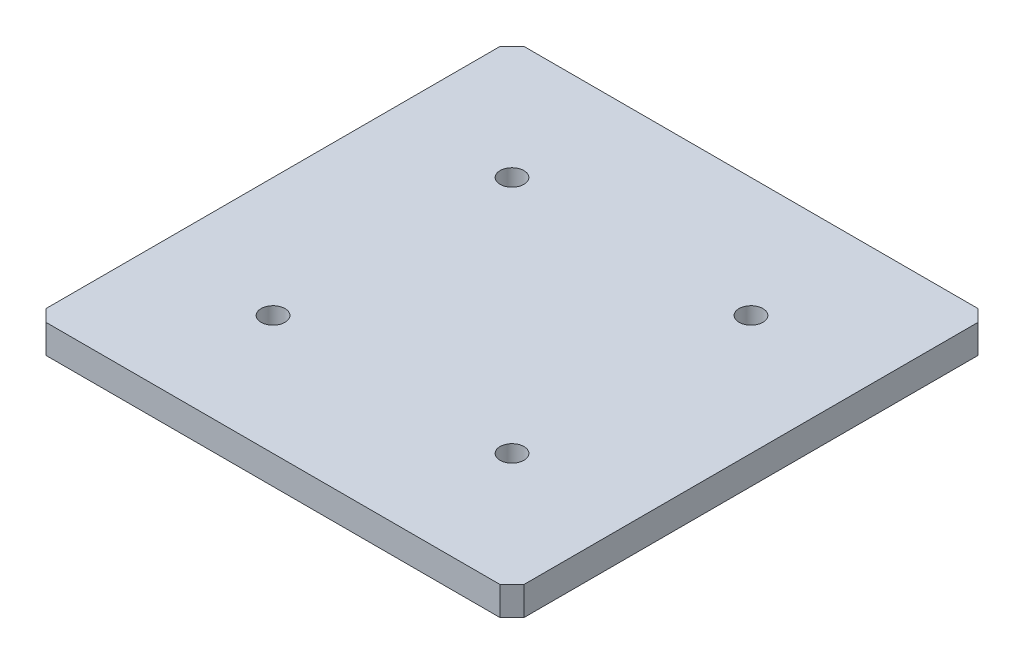
ISO-10303-21;
HEADER;
FILE_DESCRIPTION(('STEP AP214'),'2;1');
FILE_NAME('part.step','',(''),(''),'','','');
FILE_SCHEMA(('AUTOMOTIVE_DESIGN { 1 0 10303 214 1 1 1 1 }'));
ENDSEC;
DATA;
#1=APPLICATION_CONTEXT('core data for automotive mechanical design processes');
#2=APPLICATION_PROTOCOL_DEFINITION('international standard','automotive_design',2000,#1);
#3=PRODUCT_CONTEXT('',#1,'mechanical');
#4=PRODUCT('Part','Part','',(#3));
#5=PRODUCT_RELATED_PRODUCT_CATEGORY('part','',(#4));
#6=PRODUCT_DEFINITION_FORMATION('','',#4);
#7=PRODUCT_DEFINITION_CONTEXT('part definition',#1,'design');
#8=PRODUCT_DEFINITION('design','',#6,#7);
#9=PRODUCT_DEFINITION_SHAPE('','',#8);
#10=(LENGTH_UNIT() NAMED_UNIT(*) SI_UNIT(.MILLI.,.METRE.));
#11=(NAMED_UNIT(*) PLANE_ANGLE_UNIT() SI_UNIT($,.RADIAN.));
#12=(NAMED_UNIT(*) SI_UNIT($,.STERADIAN.) SOLID_ANGLE_UNIT());
#13=UNCERTAINTY_MEASURE_WITH_UNIT(LENGTH_MEASURE(1.E-05),#10,'distance_accuracy_value','');
#14=(GEOMETRIC_REPRESENTATION_CONTEXT(3) GLOBAL_UNCERTAINTY_ASSIGNED_CONTEXT((#13)) GLOBAL_UNIT_ASSIGNED_CONTEXT((#10,
#11,#12)) REPRESENTATION_CONTEXT('',''));
#15=CARTESIAN_POINT('',(0.,0.,0.));
#16=DIRECTION('',(0.,0.,1.));
#17=DIRECTION('',(1.,0.,0.));
#18=AXIS2_PLACEMENT_3D('',#15,#16,#17);
#19=CARTESIAN_POINT('',(-100.,12.,100.));
#20=DIRECTION('',(1.,0.,0.));
#21=DIRECTION('',(0.,0.,-1.));
#22=AXIS2_PLACEMENT_3D('',#19,#20,#21);
#23=PLANE('',#22);
#24=DIRECTION('',(0.,0.,1.));
#25=VECTOR('',#24,1.);
#26=CARTESIAN_POINT('',(-100.,12.,100.));
#27=LINE('',#26,#25);
#28=CARTESIAN_POINT('',(-100.,12.,-94.9999999999999));
#29=VERTEX_POINT('',#28);
#30=CARTESIAN_POINT('',(-100.,12.,95.));
#31=VERTEX_POINT('',#30);
#32=EDGE_CURVE('E120',#29,#31,#27,.T.);
#33=ORIENTED_EDGE('',*,*,#32,.F.);
#34=DIRECTION('',(0.,-1.,0.));
#35=VECTOR('',#34,1.);
#36=CARTESIAN_POINT('',(-100.,12.,-95.));
#37=LINE('',#36,#35);
#38=CARTESIAN_POINT('',(-100.,0.,-95.));
#39=VERTEX_POINT('',#38);
#40=EDGE_CURVE('E105',#29,#39,#37,.T.);
#41=ORIENTED_EDGE('',*,*,#40,.T.);
#42=DIRECTION('',(0.,0.,1.));
#43=VECTOR('',#42,1.);
#44=CARTESIAN_POINT('',(-100.,0.,100.));
#45=LINE('',#44,#43);
#46=CARTESIAN_POINT('',(-100.,0.,95.));
#47=VERTEX_POINT('',#46);
#48=EDGE_CURVE('E117',#39,#47,#45,.T.);
#49=ORIENTED_EDGE('',*,*,#48,.T.);
#50=DIRECTION('',(0.,1.,0.));
#51=VECTOR('',#50,1.);
#52=CARTESIAN_POINT('',(-100.,12.,95.));
#53=LINE('',#52,#51);
#54=EDGE_CURVE('E122',#47,#31,#53,.T.);
#55=ORIENTED_EDGE('',*,*,#54,.T.);
#56=EDGE_LOOP('',(#33,#41,#49,#55));
#57=FACE_BOUND('',#56,.T.);
#58=ADVANCED_FACE('F35',(#57),#23,.F.);
#59=CARTESIAN_POINT('',(-100.,12.,100.));
#60=DIRECTION('',(0.,0.,-1.));
#61=DIRECTION('',(-1.,0.,0.));
#62=AXIS2_PLACEMENT_3D('',#59,#60,#61);
#63=PLANE('',#62);
#64=DIRECTION('',(1.,0.,0.));
#65=VECTOR('',#64,1.);
#66=CARTESIAN_POINT('',(-100.,0.,100.));
#67=LINE('',#66,#65);
#68=CARTESIAN_POINT('',(-95.,0.,100.));
#69=VERTEX_POINT('',#68);
#70=CARTESIAN_POINT('',(95.,0.,100.));
#71=VERTEX_POINT('',#70);
#72=EDGE_CURVE('E126',#69,#71,#67,.T.);
#73=ORIENTED_EDGE('',*,*,#72,.T.);
#74=DIRECTION('',(0.,1.,0.));
#75=VECTOR('',#74,1.);
#76=CARTESIAN_POINT('',(95.,12.,100.));
#77=LINE('',#76,#75);
#78=CARTESIAN_POINT('',(94.9999999999999,12.,100.));
#79=VERTEX_POINT('',#78);
#80=EDGE_CURVE('E11',#71,#79,#77,.T.);
#81=ORIENTED_EDGE('',*,*,#80,.T.);
#82=DIRECTION('',(1.,0.,0.));
#83=VECTOR('',#82,1.);
#84=CARTESIAN_POINT('',(-100.,12.,100.));
#85=LINE('',#84,#83);
#86=CARTESIAN_POINT('',(-95.,12.,100.));
#87=VERTEX_POINT('',#86);
#88=EDGE_CURVE('E166',#87,#79,#85,.T.);
#89=ORIENTED_EDGE('',*,*,#88,.F.);
#90=DIRECTION('',(0.,-1.,0.));
#91=VECTOR('',#90,1.);
#92=CARTESIAN_POINT('',(-95.,12.,100.));
#93=LINE('',#92,#91);
#94=EDGE_CURVE('E43',#87,#69,#93,.T.);
#95=ORIENTED_EDGE('',*,*,#94,.T.);
#96=EDGE_LOOP('',(#73,#81,#89,#95));
#97=FACE_BOUND('',#96,.T.);
#98=ADVANCED_FACE('F164',(#97),#63,.F.);
#99=CARTESIAN_POINT('',(100.,12.,100.));
#100=DIRECTION('',(-1.,0.,0.));
#101=DIRECTION('',(0.,0.,1.));
#102=AXIS2_PLACEMENT_3D('',#99,#100,#101);
#103=PLANE('',#102);
#104=DIRECTION('',(0.,0.,-1.));
#105=VECTOR('',#104,1.);
#106=CARTESIAN_POINT('',(100.,0.,100.));
#107=LINE('',#106,#105);
#108=CARTESIAN_POINT('',(100.,0.,95.));
#109=VERTEX_POINT('',#108);
#110=CARTESIAN_POINT('',(100.,0.,-95.));
#111=VERTEX_POINT('',#110);
#112=EDGE_CURVE('E130',#109,#111,#107,.T.);
#113=ORIENTED_EDGE('',*,*,#112,.T.);
#114=DIRECTION('',(0.,1.,0.));
#115=VECTOR('',#114,1.);
#116=CARTESIAN_POINT('',(100.,12.,-95.));
#117=LINE('',#116,#115);
#118=CARTESIAN_POINT('',(100.,12.,-94.9999999999999));
#119=VERTEX_POINT('',#118);
#120=EDGE_CURVE('E50',#111,#119,#117,.T.);
#121=ORIENTED_EDGE('',*,*,#120,.T.);
#122=DIRECTION('',(0.,0.,-1.));
#123=VECTOR('',#122,1.);
#124=CARTESIAN_POINT('',(100.,12.,100.));
#125=LINE('',#124,#123);
#126=CARTESIAN_POINT('',(100.,12.,95.));
#127=VERTEX_POINT('',#126);
#128=EDGE_CURVE('E174',#127,#119,#125,.T.);
#129=ORIENTED_EDGE('',*,*,#128,.F.);
#130=DIRECTION('',(0.,-1.,0.));
#131=VECTOR('',#130,1.);
#132=CARTESIAN_POINT('',(100.,12.,95.));
#133=LINE('',#132,#131);
#134=EDGE_CURVE('E157',#127,#109,#133,.T.);
#135=ORIENTED_EDGE('',*,*,#134,.T.);
#136=EDGE_LOOP('',(#113,#121,#129,#135));
#137=FACE_BOUND('',#136,.T.);
#138=ADVANCED_FACE('F173',(#137),#103,.F.);
#139=CARTESIAN_POINT('',(-100.,12.,-100.));
#140=DIRECTION('',(0.,0.,1.));
#141=DIRECTION('',(1.,0.,0.));
#142=AXIS2_PLACEMENT_3D('',#139,#140,#141);
#143=PLANE('',#142);
#144=DIRECTION('',(-1.,0.,0.));
#145=VECTOR('',#144,1.);
#146=CARTESIAN_POINT('',(-100.,0.,-100.));
#147=LINE('',#146,#145);
#148=CARTESIAN_POINT('',(95.,0.,-100.));
#149=VERTEX_POINT('',#148);
#150=CARTESIAN_POINT('',(-95.,0.,-100.));
#151=VERTEX_POINT('',#150);
#152=EDGE_CURVE('E140',#149,#151,#147,.T.);
#153=ORIENTED_EDGE('',*,*,#152,.T.);
#154=DIRECTION('',(0.,1.,0.));
#155=VECTOR('',#154,1.);
#156=CARTESIAN_POINT('',(-95.,12.,-100.));
#157=LINE('',#156,#155);
#158=CARTESIAN_POINT('',(-95.,12.,-100.));
#159=VERTEX_POINT('',#158);
#160=EDGE_CURVE('E106',#151,#159,#157,.T.);
#161=ORIENTED_EDGE('',*,*,#160,.T.);
#162=DIRECTION('',(-1.,0.,0.));
#163=VECTOR('',#162,1.);
#164=CARTESIAN_POINT('',(-100.,12.,-100.));
#165=LINE('',#164,#163);
#166=CARTESIAN_POINT('',(95.,12.,-100.));
#167=VERTEX_POINT('',#166);
#168=EDGE_CURVE('E136',#167,#159,#165,.T.);
#169=ORIENTED_EDGE('',*,*,#168,.F.);
#170=DIRECTION('',(0.,-1.,0.));
#171=VECTOR('',#170,1.);
#172=CARTESIAN_POINT('',(95.0000000000001,12.,-100.));
#173=LINE('',#172,#171);
#174=EDGE_CURVE('E111',#167,#149,#173,.T.);
#175=ORIENTED_EDGE('',*,*,#174,.T.);
#176=EDGE_LOOP('',(#153,#161,#169,#175));
#177=FACE_BOUND('',#176,.T.);
#178=ADVANCED_FACE('F206',(#177),#143,.F.);
#179=CARTESIAN_POINT('',(0.,12.,0.));
#180=DIRECTION('',(0.,-1.,0.));
#181=DIRECTION('',(0.,0.,-1.));
#182=AXIS2_PLACEMENT_3D('',#179,#180,#181);
#183=PLANE('',#182);
#184=CARTESIAN_POINT('',(50.,12.,50.));
#185=DIRECTION('',(0.,1.,0.));
#186=DIRECTION('',(0.,0.,1.));
#187=AXIS2_PLACEMENT_3D('',#184,#185,#186);
#188=CIRCLE('',#187,5.00000000000001);
#189=CARTESIAN_POINT('',(50.,12.,55.));
#190=VERTEX_POINT('',#189);
#191=EDGE_CURVE('E192',#190,#190,#188,.T.);
#192=ORIENTED_EDGE('',*,*,#191,.F.);
#193=EDGE_LOOP('',(#192));
#194=FACE_BOUND('',#193,.T.);
#195=CARTESIAN_POINT('',(-50.,12.,50.));
#196=DIRECTION('',(0.,1.,0.));
#197=DIRECTION('',(0.,0.,1.));
#198=AXIS2_PLACEMENT_3D('',#195,#196,#197);
#199=CIRCLE('',#198,5.00000000000001);
#200=CARTESIAN_POINT('',(-50.,12.,55.));
#201=VERTEX_POINT('',#200);
#202=EDGE_CURVE('E186',#201,#201,#199,.T.);
#203=ORIENTED_EDGE('',*,*,#202,.F.);
#204=EDGE_LOOP('',(#203));
#205=FACE_BOUND('',#204,.T.);
#206=CARTESIAN_POINT('',(50.,12.,-50.));
#207=DIRECTION('',(0.,1.,0.));
#208=DIRECTION('',(0.,0.,1.));
#209=AXIS2_PLACEMENT_3D('',#206,#207,#208);
#210=CIRCLE('',#209,5.00000000000001);
#211=CARTESIAN_POINT('',(50.,12.,-45.));
#212=VERTEX_POINT('',#211);
#213=EDGE_CURVE('E181',#212,#212,#210,.T.);
#214=ORIENTED_EDGE('',*,*,#213,.F.);
#215=EDGE_LOOP('',(#214));
#216=FACE_BOUND('',#215,.T.);
#217=CARTESIAN_POINT('',(-50.,12.,-50.));
#218=DIRECTION('',(0.,1.,0.));
#219=DIRECTION('',(0.,0.,1.));
#220=AXIS2_PLACEMENT_3D('',#217,#218,#219);
#221=CIRCLE('',#220,5.00000000000001);
#222=CARTESIAN_POINT('',(-50.,12.,-45.));
#223=VERTEX_POINT('',#222);
#224=EDGE_CURVE('E127',#223,#223,#221,.T.);
#225=ORIENTED_EDGE('',*,*,#224,.F.);
#226=EDGE_LOOP('',(#225));
#227=FACE_BOUND('',#226,.T.);
#228=ORIENTED_EDGE('',*,*,#168,.T.);
#229=DIRECTION('',(0.707106781186548,0.,-0.707106781186548));
#230=VECTOR('',#229,1.);
#231=CARTESIAN_POINT('',(-100.,12.,-95.));
#232=LINE('',#231,#230);
#233=EDGE_CURVE('E155',#159,#29,#232,.F.);
#234=ORIENTED_EDGE('',*,*,#233,.T.);
#235=ORIENTED_EDGE('',*,*,#32,.T.);
#236=DIRECTION('',(-0.707106781186548,0.,-0.707106781186548));
#237=VECTOR('',#236,1.);
#238=CARTESIAN_POINT('',(-95.,12.,100.));
#239=LINE('',#238,#237);
#240=EDGE_CURVE('E150',#31,#87,#239,.F.);
#241=ORIENTED_EDGE('',*,*,#240,.T.);
#242=ORIENTED_EDGE('',*,*,#88,.T.);
#243=DIRECTION('',(-0.707106781186548,0.,0.707106781186548));
#244=VECTOR('',#243,1.);
#245=CARTESIAN_POINT('',(100.,12.,95.));
#246=LINE('',#245,#244);
#247=EDGE_CURVE('E57',#79,#127,#246,.F.);
#248=ORIENTED_EDGE('',*,*,#247,.T.);
#249=ORIENTED_EDGE('',*,*,#128,.T.);
#250=DIRECTION('',(0.707106781186548,0.,0.707106781186548));
#251=VECTOR('',#250,1.);
#252=CARTESIAN_POINT('',(95.0000000000001,12.,-100.));
#253=LINE('',#252,#251);
#254=EDGE_CURVE('E153',#119,#167,#253,.F.);
#255=ORIENTED_EDGE('',*,*,#254,.T.);
#256=EDGE_LOOP('',(#228,#234,#235,#241,#242,#248,#249,#255));
#257=FACE_BOUND('',#256,.T.);
#258=ADVANCED_FACE('F203',(#194,#205,#216,#227,#257),#183,.F.);
#259=CARTESIAN_POINT('',(0.,0.,0.));
#260=DIRECTION('',(0.,-1.,0.));
#261=DIRECTION('',(0.,0.,-1.));
#262=AXIS2_PLACEMENT_3D('',#259,#260,#261);
#263=PLANE('',#262);
#264=CARTESIAN_POINT('',(50.,0.,50.));
#265=DIRECTION('',(0.,-1.,0.));
#266=DIRECTION('',(0.,0.,-1.));
#267=AXIS2_PLACEMENT_3D('',#264,#265,#266);
#268=CIRCLE('',#267,5.00000000000001);
#269=CARTESIAN_POINT('',(50.,0.,45.));
#270=VERTEX_POINT('',#269);
#271=EDGE_CURVE('E195',#270,#270,#268,.F.);
#272=ORIENTED_EDGE('',*,*,#271,.T.);
#273=EDGE_LOOP('',(#272));
#274=FACE_BOUND('',#273,.T.);
#275=CARTESIAN_POINT('',(-50.,0.,50.));
#276=DIRECTION('',(0.,-1.,0.));
#277=DIRECTION('',(0.,0.,-1.));
#278=AXIS2_PLACEMENT_3D('',#275,#276,#277);
#279=CIRCLE('',#278,5.00000000000001);
#280=CARTESIAN_POINT('',(-50.,0.,45.));
#281=VERTEX_POINT('',#280);
#282=EDGE_CURVE('E189',#281,#281,#279,.F.);
#283=ORIENTED_EDGE('',*,*,#282,.T.);
#284=EDGE_LOOP('',(#283));
#285=FACE_BOUND('',#284,.T.);
#286=CARTESIAN_POINT('',(50.,0.,-50.));
#287=DIRECTION('',(0.,-1.,0.));
#288=DIRECTION('',(0.,0.,-1.));
#289=AXIS2_PLACEMENT_3D('',#286,#287,#288);
#290=CIRCLE('',#289,5.00000000000001);
#291=CARTESIAN_POINT('',(50.,0.,-55.));
#292=VERTEX_POINT('',#291);
#293=EDGE_CURVE('E183',#292,#292,#290,.F.);
#294=ORIENTED_EDGE('',*,*,#293,.T.);
#295=EDGE_LOOP('',(#294));
#296=FACE_BOUND('',#295,.T.);
#297=CARTESIAN_POINT('',(-50.,0.,-50.));
#298=DIRECTION('',(0.,-1.,0.));
#299=DIRECTION('',(0.,0.,-1.));
#300=AXIS2_PLACEMENT_3D('',#297,#298,#299);
#301=CIRCLE('',#300,5.00000000000001);
#302=CARTESIAN_POINT('',(-50.,0.,-55.));
#303=VERTEX_POINT('',#302);
#304=EDGE_CURVE('E133',#303,#303,#301,.F.);
#305=ORIENTED_EDGE('',*,*,#304,.T.);
#306=EDGE_LOOP('',(#305));
#307=FACE_BOUND('',#306,.T.);
#308=ORIENTED_EDGE('',*,*,#48,.F.);
#309=DIRECTION('',(-0.707106781186548,0.,0.707106781186548));
#310=VECTOR('',#309,1.);
#311=CARTESIAN_POINT('',(-97.5,0.,-97.5));
#312=LINE('',#311,#310);
#313=EDGE_CURVE('E101',#39,#151,#312,.F.);
#314=ORIENTED_EDGE('',*,*,#313,.T.);
#315=ORIENTED_EDGE('',*,*,#152,.F.);
#316=DIRECTION('',(-0.707106781186548,0.,-0.707106781186548));
#317=VECTOR('',#316,1.);
#318=CARTESIAN_POINT('',(97.5,0.,-97.5));
#319=LINE('',#318,#317);
#320=EDGE_CURVE('E112',#149,#111,#319,.F.);
#321=ORIENTED_EDGE('',*,*,#320,.T.);
#322=ORIENTED_EDGE('',*,*,#112,.F.);
#323=DIRECTION('',(0.707106781186548,0.,-0.707106781186548));
#324=VECTOR('',#323,1.);
#325=CARTESIAN_POINT('',(97.5,0.,97.5));
#326=LINE('',#325,#324);
#327=EDGE_CURVE('E144',#109,#71,#326,.F.);
#328=ORIENTED_EDGE('',*,*,#327,.T.);
#329=ORIENTED_EDGE('',*,*,#72,.F.);
#330=DIRECTION('',(0.707106781186548,0.,0.707106781186548));
#331=VECTOR('',#330,1.);
#332=CARTESIAN_POINT('',(-97.5,0.,97.5));
#333=LINE('',#332,#331);
#334=EDGE_CURVE('E121',#69,#47,#333,.F.);
#335=ORIENTED_EDGE('',*,*,#334,.T.);
#336=EDGE_LOOP('',(#308,#314,#315,#321,#322,#328,#329,#335));
#337=FACE_BOUND('',#336,.T.);
#338=ADVANCED_FACE('F124',(#274,#285,#296,#307,#337),#263,.T.);
#339=CARTESIAN_POINT('',(-50.,-0.000999999999999265,-50.));
#340=DIRECTION('',(0.,1.,0.));
#341=DIRECTION('',(0.,0.,1.));
#342=AXIS2_PLACEMENT_3D('',#339,#340,#341);
#343=CYLINDRICAL_SURFACE('',#342,5.00000000000001);
#344=ORIENTED_EDGE('',*,*,#304,.F.);
#345=EDGE_LOOP('',(#344));
#346=FACE_BOUND('',#345,.T.);
#347=ORIENTED_EDGE('',*,*,#224,.T.);
#348=EDGE_LOOP('',(#347));
#349=FACE_BOUND('',#348,.T.);
#350=ADVANCED_FACE('F237',(#346,#349),#343,.F.);
#351=CARTESIAN_POINT('',(50.,-0.000999999999999265,-50.));
#352=DIRECTION('',(0.,1.,0.));
#353=DIRECTION('',(0.,0.,1.));
#354=AXIS2_PLACEMENT_3D('',#351,#352,#353);
#355=CYLINDRICAL_SURFACE('',#354,5.00000000000001);
#356=ORIENTED_EDGE('',*,*,#293,.F.);
#357=EDGE_LOOP('',(#356));
#358=FACE_BOUND('',#357,.T.);
#359=ORIENTED_EDGE('',*,*,#213,.T.);
#360=EDGE_LOOP('',(#359));
#361=FACE_BOUND('',#360,.T.);
#362=ADVANCED_FACE('F242',(#358,#361),#355,.F.);
#363=CARTESIAN_POINT('',(-50.,-0.000999999999999265,50.));
#364=DIRECTION('',(0.,1.,0.));
#365=DIRECTION('',(0.,0.,1.));
#366=AXIS2_PLACEMENT_3D('',#363,#364,#365);
#367=CYLINDRICAL_SURFACE('',#366,5.00000000000001);
#368=ORIENTED_EDGE('',*,*,#282,.F.);
#369=EDGE_LOOP('',(#368));
#370=FACE_BOUND('',#369,.T.);
#371=ORIENTED_EDGE('',*,*,#202,.T.);
#372=EDGE_LOOP('',(#371));
#373=FACE_BOUND('',#372,.T.);
#374=ADVANCED_FACE('F246',(#370,#373),#367,.F.);
#375=CARTESIAN_POINT('',(50.,-0.000999999999999265,50.));
#376=DIRECTION('',(0.,1.,0.));
#377=DIRECTION('',(0.,0.,1.));
#378=AXIS2_PLACEMENT_3D('',#375,#376,#377);
#379=CYLINDRICAL_SURFACE('',#378,5.00000000000001);
#380=ORIENTED_EDGE('',*,*,#271,.F.);
#381=EDGE_LOOP('',(#380));
#382=FACE_BOUND('',#381,.T.);
#383=ORIENTED_EDGE('',*,*,#191,.T.);
#384=EDGE_LOOP('',(#383));
#385=FACE_BOUND('',#384,.T.);
#386=ADVANCED_FACE('F201',(#382,#385),#379,.F.);
#387=CARTESIAN_POINT('',(-100.,12.,-95.));
#388=DIRECTION('',(0.707106781186547,0.,0.707106781186547));
#389=DIRECTION('',(0.,-1.,0.));
#390=AXIS2_PLACEMENT_3D('',#387,#388,#389);
#391=PLANE('',#390);
#392=ORIENTED_EDGE('',*,*,#233,.F.);
#393=ORIENTED_EDGE('',*,*,#160,.F.);
#394=ORIENTED_EDGE('',*,*,#313,.F.);
#395=ORIENTED_EDGE('',*,*,#40,.F.);
#396=EDGE_LOOP('',(#392,#393,#394,#395));
#397=FACE_BOUND('',#396,.T.);
#398=ADVANCED_FACE('F104',(#397),#391,.F.);
#399=CARTESIAN_POINT('',(95.0000000000001,12.,-100.));
#400=DIRECTION('',(-0.707106781186548,0.,0.707106781186548));
#401=DIRECTION('',(0.,-1.,0.));
#402=AXIS2_PLACEMENT_3D('',#399,#400,#401);
#403=PLANE('',#402);
#404=ORIENTED_EDGE('',*,*,#254,.F.);
#405=ORIENTED_EDGE('',*,*,#120,.F.);
#406=ORIENTED_EDGE('',*,*,#320,.F.);
#407=ORIENTED_EDGE('',*,*,#174,.F.);
#408=EDGE_LOOP('',(#404,#405,#406,#407));
#409=FACE_BOUND('',#408,.T.);
#410=ADVANCED_FACE('F217',(#409),#403,.F.);
#411=CARTESIAN_POINT('',(100.,12.,95.));
#412=DIRECTION('',(-0.707106781186547,0.,-0.707106781186547));
#413=DIRECTION('',(0.,-1.,0.));
#414=AXIS2_PLACEMENT_3D('',#411,#412,#413);
#415=PLANE('',#414);
#416=ORIENTED_EDGE('',*,*,#247,.F.);
#417=ORIENTED_EDGE('',*,*,#80,.F.);
#418=ORIENTED_EDGE('',*,*,#327,.F.);
#419=ORIENTED_EDGE('',*,*,#134,.F.);
#420=EDGE_LOOP('',(#416,#417,#418,#419));
#421=FACE_BOUND('',#420,.T.);
#422=ADVANCED_FACE('F172',(#421),#415,.F.);
#423=CARTESIAN_POINT('',(-95.,12.,100.));
#424=DIRECTION('',(0.707106781186548,0.,-0.707106781186548));
#425=DIRECTION('',(0.,-1.,0.));
#426=AXIS2_PLACEMENT_3D('',#423,#424,#425);
#427=PLANE('',#426);
#428=ORIENTED_EDGE('',*,*,#240,.F.);
#429=ORIENTED_EDGE('',*,*,#54,.F.);
#430=ORIENTED_EDGE('',*,*,#334,.F.);
#431=ORIENTED_EDGE('',*,*,#94,.F.);
#432=EDGE_LOOP('',(#428,#429,#430,#431));
#433=FACE_BOUND('',#432,.T.);
#434=ADVANCED_FACE('F37',(#433),#427,.F.);
#435=CLOSED_SHELL('',(#58,#98,#138,#178,#258,#338,#350,#362,#374,#386,#398,#410,#422,#434));
#436=MANIFOLD_SOLID_BREP('B2',#435);
#437=ADVANCED_BREP_SHAPE_REPRESENTATION('',(#18,#436),#14);
#438=SHAPE_DEFINITION_REPRESENTATION(#9,#437);
ENDSEC;
END-ISO-10303-21;
